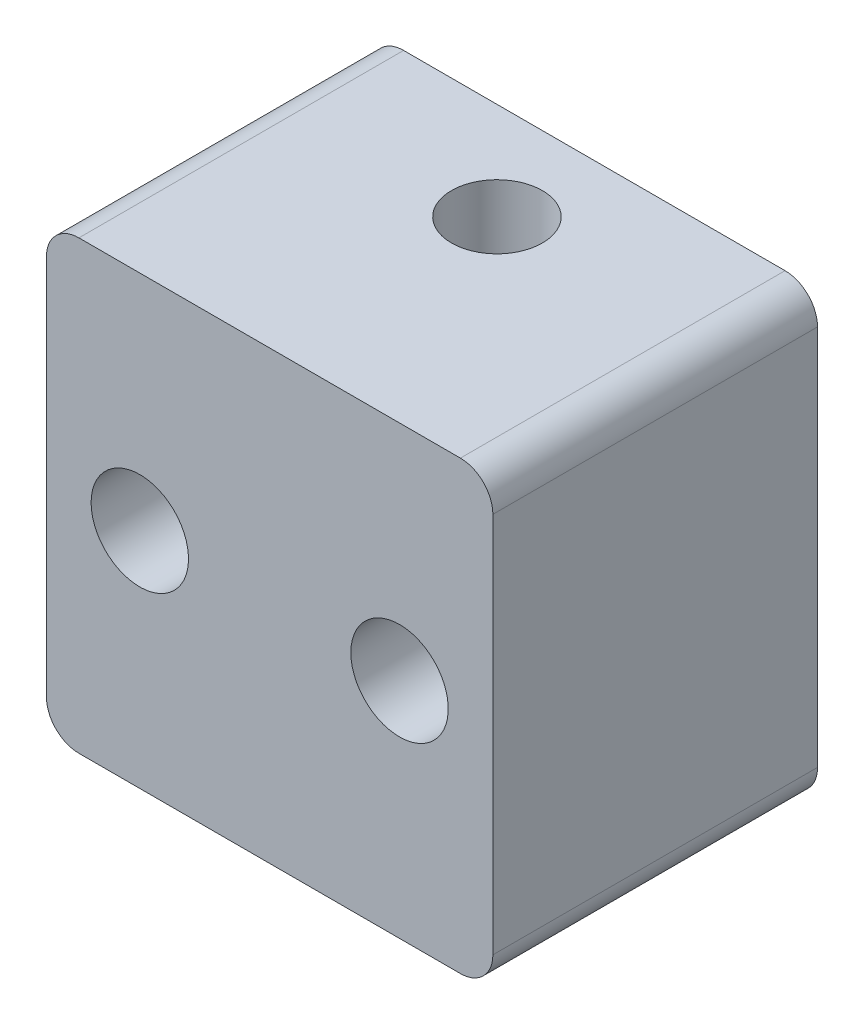
ISO-10303-21;
HEADER;
FILE_DESCRIPTION(('STEP AP214'),'2;1');
FILE_NAME('part.step','',(''),(''),'','','');
FILE_SCHEMA(('AUTOMOTIVE_DESIGN { 1 0 10303 214 1 1 1 1 }'));
ENDSEC;
DATA;
#1=APPLICATION_CONTEXT('core data for automotive mechanical design processes');
#2=APPLICATION_PROTOCOL_DEFINITION('international standard','automotive_design',2000,#1);
#3=PRODUCT_CONTEXT('',#1,'mechanical');
#4=PRODUCT('Part','Part','',(#3));
#5=PRODUCT_RELATED_PRODUCT_CATEGORY('part','',(#4));
#6=PRODUCT_DEFINITION_FORMATION('','',#4);
#7=PRODUCT_DEFINITION_CONTEXT('part definition',#1,'design');
#8=PRODUCT_DEFINITION('design','',#6,#7);
#9=PRODUCT_DEFINITION_SHAPE('','',#8);
#10=(LENGTH_UNIT() NAMED_UNIT(*) SI_UNIT(.MILLI.,.METRE.));
#11=(NAMED_UNIT(*) PLANE_ANGLE_UNIT() SI_UNIT($,.RADIAN.));
#12=(NAMED_UNIT(*) SI_UNIT($,.STERADIAN.) SOLID_ANGLE_UNIT());
#13=UNCERTAINTY_MEASURE_WITH_UNIT(LENGTH_MEASURE(1.E-05),#10,'distance_accuracy_value','');
#14=(GEOMETRIC_REPRESENTATION_CONTEXT(3) GLOBAL_UNCERTAINTY_ASSIGNED_CONTEXT((#13)) GLOBAL_UNIT_ASSIGNED_CONTEXT((#10,
#11,#12)) REPRESENTATION_CONTEXT('',''));
#15=CARTESIAN_POINT('',(0.,0.,0.));
#16=DIRECTION('',(0.,0.,1.));
#17=DIRECTION('',(1.,0.,0.));
#18=AXIS2_PLACEMENT_3D('',#15,#16,#17);
#19=CARTESIAN_POINT('',(6.875,-6.875,29.4454364826301));
#20=DIRECTION('',(-1.,0.,0.));
#21=DIRECTION('',(0.,0.,1.));
#22=AXIS2_PLACEMENT_3D('',#19,#20,#21);
#23=PLANE('',#22);
#24=DIRECTION('',(0.,1.,0.));
#25=VECTOR('',#24,1.);
#26=CARTESIAN_POINT('',(6.875,-6.875,10.));
#27=LINE('',#26,#25);
#28=CARTESIAN_POINT('',(6.875,-5.875,10.));
#29=VERTEX_POINT('',#28);
#30=CARTESIAN_POINT('',(6.875,5.875,10.));
#31=VERTEX_POINT('',#30);
#32=EDGE_CURVE('E151',#29,#31,#27,.T.);
#33=ORIENTED_EDGE('',*,*,#32,.F.);
#34=DIRECTION('',(0.,0.,-1.));
#35=VECTOR('',#34,1.);
#36=CARTESIAN_POINT('',(6.875,-5.875,29.4454364826301));
#37=LINE('',#36,#35);
#38=CARTESIAN_POINT('',(6.875,-5.875,0.));
#39=VERTEX_POINT('',#38);
#40=EDGE_CURVE('E188',#29,#39,#37,.T.);
#41=ORIENTED_EDGE('',*,*,#40,.T.);
#42=DIRECTION('',(0.,1.,0.));
#43=VECTOR('',#42,1.);
#44=CARTESIAN_POINT('',(6.875,-6.875,0.));
#45=LINE('',#44,#43);
#46=CARTESIAN_POINT('',(6.875,5.875,0.));
#47=VERTEX_POINT('',#46);
#48=EDGE_CURVE('E208',#39,#47,#45,.T.);
#49=ORIENTED_EDGE('',*,*,#48,.T.);
#50=DIRECTION('',(0.,0.,-1.));
#51=VECTOR('',#50,1.);
#52=CARTESIAN_POINT('',(6.875,5.875,29.4454364826301));
#53=LINE('',#52,#51);
#54=EDGE_CURVE('E139',#47,#31,#53,.F.);
#55=ORIENTED_EDGE('',*,*,#54,.T.);
#56=EDGE_LOOP('',(#33,#41,#49,#55));
#57=FACE_BOUND('',#56,.T.);
#58=ADVANCED_FACE('F45',(#57),#23,.F.);
#59=CARTESIAN_POINT('',(-6.875,6.875,29.4454364826301));
#60=DIRECTION('',(0.,-1.,0.));
#61=DIRECTION('',(0.,0.,-1.));
#62=AXIS2_PLACEMENT_3D('',#59,#60,#61);
#63=PLANE('',#62);
#64=CARTESIAN_POINT('',(0.,6.875,3.));
#65=DIRECTION('',(0.,1.,0.));
#66=DIRECTION('',(0.,0.,1.));
#67=AXIS2_PLACEMENT_3D('',#64,#65,#66);
#68=CIRCLE('',#67,1.4);
#69=CARTESIAN_POINT('',(0.,6.875,4.4));
#70=VERTEX_POINT('',#69);
#71=EDGE_CURVE('E209',#70,#70,#68,.T.);
#72=ORIENTED_EDGE('',*,*,#71,.F.);
#73=EDGE_LOOP('',(#72));
#74=FACE_BOUND('',#73,.T.);
#75=DIRECTION('',(-1.,0.,0.));
#76=VECTOR('',#75,1.);
#77=CARTESIAN_POINT('',(-6.875,6.875,10.));
#78=LINE('',#77,#76);
#79=CARTESIAN_POINT('',(5.875,6.875,10.));
#80=VERTEX_POINT('',#79);
#81=CARTESIAN_POINT('',(-5.875,6.875,10.));
#82=VERTEX_POINT('',#81);
#83=EDGE_CURVE('E201',#80,#82,#78,.T.);
#84=ORIENTED_EDGE('',*,*,#83,.F.);
#85=DIRECTION('',(0.,0.,-1.));
#86=VECTOR('',#85,1.);
#87=CARTESIAN_POINT('',(5.875,6.875,29.4454364826301));
#88=LINE('',#87,#86);
#89=CARTESIAN_POINT('',(5.875,6.875,0.));
#90=VERTEX_POINT('',#89);
#91=EDGE_CURVE('E11',#80,#90,#88,.T.);
#92=ORIENTED_EDGE('',*,*,#91,.T.);
#93=DIRECTION('',(-1.,0.,0.));
#94=VECTOR('',#93,1.);
#95=CARTESIAN_POINT('',(-6.875,6.875,0.));
#96=LINE('',#95,#94);
#97=CARTESIAN_POINT('',(-5.875,6.875,0.));
#98=VERTEX_POINT('',#97);
#99=EDGE_CURVE('E217',#90,#98,#96,.T.);
#100=ORIENTED_EDGE('',*,*,#99,.T.);
#101=DIRECTION('',(0.,0.,-1.));
#102=VECTOR('',#101,1.);
#103=CARTESIAN_POINT('',(-5.875,6.875,29.4454364826301));
#104=LINE('',#103,#102);
#105=EDGE_CURVE('E54',#98,#82,#104,.F.);
#106=ORIENTED_EDGE('',*,*,#105,.T.);
#107=EDGE_LOOP('',(#84,#92,#100,#106));
#108=FACE_BOUND('',#107,.T.);
#109=ADVANCED_FACE('F265',(#74,#108),#63,.F.);
#110=CARTESIAN_POINT('',(-6.875,-6.875,29.4454364826301));
#111=DIRECTION('',(1.,0.,0.));
#112=DIRECTION('',(0.,0.,-1.));
#113=AXIS2_PLACEMENT_3D('',#110,#111,#112);
#114=PLANE('',#113);
#115=DIRECTION('',(0.,-1.,0.));
#116=VECTOR('',#115,1.);
#117=CARTESIAN_POINT('',(-6.875,-6.875,0.));
#118=LINE('',#117,#116);
#119=CARTESIAN_POINT('',(-6.875,5.875,0.));
#120=VERTEX_POINT('',#119);
#121=CARTESIAN_POINT('',(-6.875,-5.875,0.));
#122=VERTEX_POINT('',#121);
#123=EDGE_CURVE('E214',#120,#122,#118,.T.);
#124=ORIENTED_EDGE('',*,*,#123,.T.);
#125=DIRECTION('',(0.,0.,-1.));
#126=VECTOR('',#125,1.);
#127=CARTESIAN_POINT('',(-6.875,-5.875,29.4454364826301));
#128=LINE('',#127,#126);
#129=CARTESIAN_POINT('',(-6.875,-5.875,10.));
#130=VERTEX_POINT('',#129);
#131=EDGE_CURVE('E177',#122,#130,#128,.F.);
#132=ORIENTED_EDGE('',*,*,#131,.T.);
#133=DIRECTION('',(0.,-1.,0.));
#134=VECTOR('',#133,1.);
#135=CARTESIAN_POINT('',(-6.875,-6.875,10.));
#136=LINE('',#135,#134);
#137=CARTESIAN_POINT('',(-6.875,5.875,10.));
#138=VERTEX_POINT('',#137);
#139=EDGE_CURVE('E134',#138,#130,#136,.T.);
#140=ORIENTED_EDGE('',*,*,#139,.F.);
#141=DIRECTION('',(0.,0.,-1.));
#142=VECTOR('',#141,1.);
#143=CARTESIAN_POINT('',(-6.875,5.875,29.4454364826301));
#144=LINE('',#143,#142);
#145=EDGE_CURVE('E173',#138,#120,#144,.T.);
#146=ORIENTED_EDGE('',*,*,#145,.T.);
#147=EDGE_LOOP('',(#124,#132,#140,#146));
#148=FACE_BOUND('',#147,.T.);
#149=ADVANCED_FACE('F270',(#148),#114,.F.);
#150=CARTESIAN_POINT('',(-6.875,-6.875,29.4454364826301));
#151=DIRECTION('',(0.,1.,0.));
#152=DIRECTION('',(0.,0.,1.));
#153=AXIS2_PLACEMENT_3D('',#150,#151,#152);
#154=PLANE('',#153);
#155=CARTESIAN_POINT('',(0.,-6.875,3.));
#156=DIRECTION('',(0.,1.,0.));
#157=DIRECTION('',(0.,0.,1.));
#158=AXIS2_PLACEMENT_3D('',#155,#156,#157);
#159=CIRCLE('',#158,1.4);
#160=CARTESIAN_POINT('',(0.,-6.875,4.4));
#161=VERTEX_POINT('',#160);
#162=EDGE_CURVE('E205',#161,#161,#159,.T.);
#163=ORIENTED_EDGE('',*,*,#162,.T.);
#164=EDGE_LOOP('',(#163));
#165=FACE_BOUND('',#164,.T.);
#166=DIRECTION('',(1.,0.,0.));
#167=VECTOR('',#166,1.);
#168=CARTESIAN_POINT('',(-6.875,-6.875,10.));
#169=LINE('',#168,#167);
#170=CARTESIAN_POINT('',(-5.875,-6.875,10.));
#171=VERTEX_POINT('',#170);
#172=CARTESIAN_POINT('',(5.875,-6.875,10.));
#173=VERTEX_POINT('',#172);
#174=EDGE_CURVE('E131',#171,#173,#169,.T.);
#175=ORIENTED_EDGE('',*,*,#174,.F.);
#176=DIRECTION('',(0.,0.,-1.));
#177=VECTOR('',#176,1.);
#178=CARTESIAN_POINT('',(-5.875,-6.875,29.4454364826301));
#179=LINE('',#178,#177);
#180=CARTESIAN_POINT('',(-5.875,-6.875,0.));
#181=VERTEX_POINT('',#180);
#182=EDGE_CURVE('E146',#171,#181,#179,.T.);
#183=ORIENTED_EDGE('',*,*,#182,.T.);
#184=DIRECTION('',(1.,0.,0.));
#185=VECTOR('',#184,1.);
#186=CARTESIAN_POINT('',(-6.875,-6.875,0.));
#187=LINE('',#186,#185);
#188=CARTESIAN_POINT('',(5.875,-6.875,0.));
#189=VERTEX_POINT('',#188);
#190=EDGE_CURVE('E152',#181,#189,#187,.T.);
#191=ORIENTED_EDGE('',*,*,#190,.T.);
#192=DIRECTION('',(0.,0.,-1.));
#193=VECTOR('',#192,1.);
#194=CARTESIAN_POINT('',(5.875,-6.875,29.4454364826301));
#195=LINE('',#194,#193);
#196=EDGE_CURVE('E149',#189,#173,#195,.F.);
#197=ORIENTED_EDGE('',*,*,#196,.T.);
#198=EDGE_LOOP('',(#175,#183,#191,#197));
#199=FACE_BOUND('',#198,.T.);
#200=ADVANCED_FACE('F144',(#165,#199),#154,.F.);
#201=CARTESIAN_POINT('',(0.,0.,0.));
#202=DIRECTION('',(0.,0.,-1.));
#203=DIRECTION('',(-1.,0.,0.));
#204=AXIS2_PLACEMENT_3D('',#201,#202,#203);
#205=PLANE('',#204);
#206=CARTESIAN_POINT('',(-4.,0.,0.));
#207=DIRECTION('',(0.,0.,-1.));
#208=DIRECTION('',(-1.,0.,0.));
#209=AXIS2_PLACEMENT_3D('',#206,#207,#208);
#210=CIRCLE('',#209,1.5);
#211=CARTESIAN_POINT('',(-5.5,0.,0.));
#212=VERTEX_POINT('',#211);
#213=EDGE_CURVE('E219',#212,#212,#210,.T.);
#214=ORIENTED_EDGE('',*,*,#213,.F.);
#215=EDGE_LOOP('',(#214));
#216=FACE_BOUND('',#215,.T.);
#217=CARTESIAN_POINT('',(4.,0.,0.));
#218=DIRECTION('',(0.,0.,-1.));
#219=DIRECTION('',(-1.,0.,0.));
#220=AXIS2_PLACEMENT_3D('',#217,#218,#219);
#221=CIRCLE('',#220,1.5);
#222=CARTESIAN_POINT('',(2.5,0.,0.));
#223=VERTEX_POINT('',#222);
#224=EDGE_CURVE('E198',#223,#223,#221,.T.);
#225=ORIENTED_EDGE('',*,*,#224,.F.);
#226=EDGE_LOOP('',(#225));
#227=FACE_BOUND('',#226,.T.);
#228=ORIENTED_EDGE('',*,*,#190,.F.);
#229=CARTESIAN_POINT('',(-5.875,-5.875,0.));
#230=DIRECTION('',(0.,0.,-1.));
#231=DIRECTION('',(-1.,0.,0.));
#232=AXIS2_PLACEMENT_3D('',#229,#230,#231);
#233=CIRCLE('',#232,1.);
#234=EDGE_CURVE('E155',#181,#122,#233,.T.);
#235=ORIENTED_EDGE('',*,*,#234,.T.);
#236=ORIENTED_EDGE('',*,*,#123,.F.);
#237=CARTESIAN_POINT('',(-5.875,5.875,0.));
#238=DIRECTION('',(0.,0.,-1.));
#239=DIRECTION('',(-1.,0.,0.));
#240=AXIS2_PLACEMENT_3D('',#237,#238,#239);
#241=CIRCLE('',#240,1.);
#242=EDGE_CURVE('E157',#120,#98,#241,.T.);
#243=ORIENTED_EDGE('',*,*,#242,.T.);
#244=ORIENTED_EDGE('',*,*,#99,.F.);
#245=CARTESIAN_POINT('',(5.875,5.875,0.));
#246=DIRECTION('',(0.,0.,-1.));
#247=DIRECTION('',(-1.,0.,0.));
#248=AXIS2_PLACEMENT_3D('',#245,#246,#247);
#249=CIRCLE('',#248,1.);
#250=EDGE_CURVE('E161',#90,#47,#249,.T.);
#251=ORIENTED_EDGE('',*,*,#250,.T.);
#252=ORIENTED_EDGE('',*,*,#48,.F.);
#253=CARTESIAN_POINT('',(5.875,-5.875,0.));
#254=DIRECTION('',(0.,0.,-1.));
#255=DIRECTION('',(-1.,0.,0.));
#256=AXIS2_PLACEMENT_3D('',#253,#254,#255);
#257=CIRCLE('',#256,1.);
#258=EDGE_CURVE('E168',#39,#189,#257,.T.);
#259=ORIENTED_EDGE('',*,*,#258,.T.);
#260=EDGE_LOOP('',(#228,#235,#236,#243,#244,#251,#252,#259));
#261=FACE_BOUND('',#260,.T.);
#262=ADVANCED_FACE('F248',(#216,#227,#261),#205,.T.);
#263=CARTESIAN_POINT('',(0.,0.,10.));
#264=DIRECTION('',(0.,0.,1.));
#265=DIRECTION('',(1.,0.,0.));
#266=AXIS2_PLACEMENT_3D('',#263,#264,#265);
#267=PLANE('',#266);
#268=CARTESIAN_POINT('',(-4.,0.,10.));
#269=DIRECTION('',(0.,0.,-1.));
#270=DIRECTION('',(-1.,0.,0.));
#271=AXIS2_PLACEMENT_3D('',#268,#269,#270);
#272=CIRCLE('',#271,1.5);
#273=CARTESIAN_POINT('',(-5.5,0.,10.));
#274=VERTEX_POINT('',#273);
#275=EDGE_CURVE('E193',#274,#274,#272,.T.);
#276=ORIENTED_EDGE('',*,*,#275,.T.);
#277=EDGE_LOOP('',(#276));
#278=FACE_BOUND('',#277,.T.);
#279=CARTESIAN_POINT('',(4.,0.,10.));
#280=DIRECTION('',(0.,0.,-1.));
#281=DIRECTION('',(-1.,0.,0.));
#282=AXIS2_PLACEMENT_3D('',#279,#280,#281);
#283=CIRCLE('',#282,1.5);
#284=CARTESIAN_POINT('',(2.5,0.,10.));
#285=VERTEX_POINT('',#284);
#286=EDGE_CURVE('E195',#285,#285,#283,.T.);
#287=ORIENTED_EDGE('',*,*,#286,.T.);
#288=EDGE_LOOP('',(#287));
#289=FACE_BOUND('',#288,.T.);
#290=ORIENTED_EDGE('',*,*,#139,.T.);
#291=CARTESIAN_POINT('',(-5.875,-5.875,10.));
#292=DIRECTION('',(0.,0.,1.));
#293=DIRECTION('',(1.,0.,0.));
#294=AXIS2_PLACEMENT_3D('',#291,#292,#293);
#295=CIRCLE('',#294,1.);
#296=EDGE_CURVE('E128',#130,#171,#295,.T.);
#297=ORIENTED_EDGE('',*,*,#296,.T.);
#298=ORIENTED_EDGE('',*,*,#174,.T.);
#299=CARTESIAN_POINT('',(5.875,-5.875,10.));
#300=DIRECTION('',(0.,0.,1.));
#301=DIRECTION('',(1.,0.,0.));
#302=AXIS2_PLACEMENT_3D('',#299,#300,#301);
#303=CIRCLE('',#302,1.);
#304=EDGE_CURVE('E140',#173,#29,#303,.T.);
#305=ORIENTED_EDGE('',*,*,#304,.T.);
#306=ORIENTED_EDGE('',*,*,#32,.T.);
#307=CARTESIAN_POINT('',(5.875,5.875,10.));
#308=DIRECTION('',(0.,0.,1.));
#309=DIRECTION('',(1.,0.,0.));
#310=AXIS2_PLACEMENT_3D('',#307,#308,#309);
#311=CIRCLE('',#310,1.);
#312=EDGE_CURVE('E73',#31,#80,#311,.T.);
#313=ORIENTED_EDGE('',*,*,#312,.T.);
#314=ORIENTED_EDGE('',*,*,#83,.T.);
#315=CARTESIAN_POINT('',(-5.875,5.875,10.));
#316=DIRECTION('',(0.,0.,1.));
#317=DIRECTION('',(1.,0.,0.));
#318=AXIS2_PLACEMENT_3D('',#315,#316,#317);
#319=CIRCLE('',#318,1.);
#320=EDGE_CURVE('E179',#82,#138,#319,.T.);
#321=ORIENTED_EDGE('',*,*,#320,.T.);
#322=EDGE_LOOP('',(#290,#297,#298,#305,#306,#313,#314,#321));
#323=FACE_BOUND('',#322,.T.);
#324=ADVANCED_FACE('F130',(#278,#289,#323),#267,.T.);
#325=CARTESIAN_POINT('',(0.,-6.875,3.));
#326=DIRECTION('',(0.,1.,0.));
#327=DIRECTION('',(0.,0.,1.));
#328=AXIS2_PLACEMENT_3D('',#325,#326,#327);
#329=CYLINDRICAL_SURFACE('',#328,1.4);
#330=ORIENTED_EDGE('',*,*,#162,.F.);
#331=EDGE_LOOP('',(#330));
#332=FACE_BOUND('',#331,.T.);
#333=ORIENTED_EDGE('',*,*,#71,.T.);
#334=EDGE_LOOP('',(#333));
#335=FACE_BOUND('',#334,.T.);
#336=ADVANCED_FACE('F288',(#332,#335),#329,.F.);
#337=CARTESIAN_POINT('',(4.,0.,10.));
#338=DIRECTION('',(0.,0.,-1.));
#339=DIRECTION('',(-1.,0.,0.));
#340=AXIS2_PLACEMENT_3D('',#337,#338,#339);
#341=CYLINDRICAL_SURFACE('',#340,1.5);
#342=ORIENTED_EDGE('',*,*,#286,.F.);
#343=EDGE_LOOP('',(#342));
#344=FACE_BOUND('',#343,.T.);
#345=ORIENTED_EDGE('',*,*,#224,.T.);
#346=EDGE_LOOP('',(#345));
#347=FACE_BOUND('',#346,.T.);
#348=ADVANCED_FACE('F244',(#344,#347),#341,.F.);
#349=CARTESIAN_POINT('',(-4.,0.,10.));
#350=DIRECTION('',(0.,0.,-1.));
#351=DIRECTION('',(-1.,0.,0.));
#352=AXIS2_PLACEMENT_3D('',#349,#350,#351);
#353=CYLINDRICAL_SURFACE('',#352,1.5);
#354=ORIENTED_EDGE('',*,*,#275,.F.);
#355=EDGE_LOOP('',(#354));
#356=FACE_BOUND('',#355,.T.);
#357=ORIENTED_EDGE('',*,*,#213,.T.);
#358=EDGE_LOOP('',(#357));
#359=FACE_BOUND('',#358,.T.);
#360=ADVANCED_FACE('F241',(#356,#359),#353,.F.);
#361=CARTESIAN_POINT('',(-5.875,-5.875,29.4454364826301));
#362=DIRECTION('',(0.,0.,-1.));
#363=DIRECTION('',(-1.,0.,0.));
#364=AXIS2_PLACEMENT_3D('',#361,#362,#363);
#365=CYLINDRICAL_SURFACE('',#364,1.);
#366=ORIENTED_EDGE('',*,*,#296,.F.);
#367=ORIENTED_EDGE('',*,*,#131,.F.);
#368=ORIENTED_EDGE('',*,*,#234,.F.);
#369=ORIENTED_EDGE('',*,*,#182,.F.);
#370=EDGE_LOOP('',(#366,#367,#368,#369));
#371=FACE_BOUND('',#370,.T.);
#372=ADVANCED_FACE('F154',(#371),#365,.T.);
#373=CARTESIAN_POINT('',(5.875,-5.875,29.4454364826301));
#374=DIRECTION('',(0.,0.,-1.));
#375=DIRECTION('',(-1.,0.,0.));
#376=AXIS2_PLACEMENT_3D('',#373,#374,#375);
#377=CYLINDRICAL_SURFACE('',#376,1.);
#378=ORIENTED_EDGE('',*,*,#304,.F.);
#379=ORIENTED_EDGE('',*,*,#196,.F.);
#380=ORIENTED_EDGE('',*,*,#258,.F.);
#381=ORIENTED_EDGE('',*,*,#40,.F.);
#382=EDGE_LOOP('',(#378,#379,#380,#381));
#383=FACE_BOUND('',#382,.T.);
#384=ADVANCED_FACE('F257',(#383),#377,.T.);
#385=CARTESIAN_POINT('',(5.875,5.875,29.4454364826301));
#386=DIRECTION('',(0.,0.,-1.));
#387=DIRECTION('',(-1.,0.,0.));
#388=AXIS2_PLACEMENT_3D('',#385,#386,#387);
#389=CYLINDRICAL_SURFACE('',#388,1.);
#390=ORIENTED_EDGE('',*,*,#312,.F.);
#391=ORIENTED_EDGE('',*,*,#54,.F.);
#392=ORIENTED_EDGE('',*,*,#250,.F.);
#393=ORIENTED_EDGE('',*,*,#91,.F.);
#394=EDGE_LOOP('',(#390,#391,#392,#393));
#395=FACE_BOUND('',#394,.T.);
#396=ADVANCED_FACE('F263',(#395),#389,.T.);
#397=CARTESIAN_POINT('',(-5.875,5.875,29.4454364826301));
#398=DIRECTION('',(0.,0.,-1.));
#399=DIRECTION('',(-1.,0.,0.));
#400=AXIS2_PLACEMENT_3D('',#397,#398,#399);
#401=CYLINDRICAL_SURFACE('',#400,1.);
#402=ORIENTED_EDGE('',*,*,#320,.F.);
#403=ORIENTED_EDGE('',*,*,#105,.F.);
#404=ORIENTED_EDGE('',*,*,#242,.F.);
#405=ORIENTED_EDGE('',*,*,#145,.F.);
#406=EDGE_LOOP('',(#402,#403,#404,#405));
#407=FACE_BOUND('',#406,.T.);
#408=ADVANCED_FACE('F47',(#407),#401,.T.);
#409=CLOSED_SHELL('',(#58,#109,#149,#200,#262,#324,#336,#348,#360,#372,#384,#396,#408));
#410=MANIFOLD_SOLID_BREP('B2',#409);
#411=ADVANCED_BREP_SHAPE_REPRESENTATION('',(#18,#410),#14);
#412=SHAPE_DEFINITION_REPRESENTATION(#9,#411);
ENDSEC;
END-ISO-10303-21;
